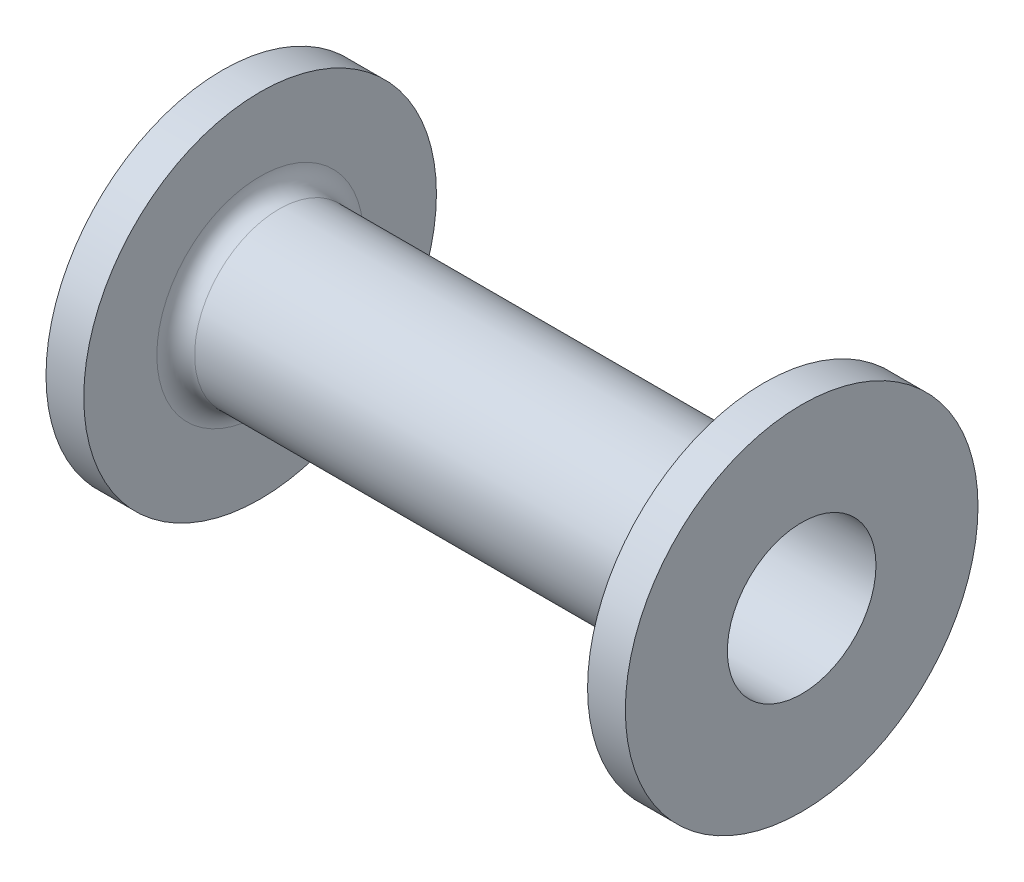
ISO-10303-21;
HEADER;
FILE_DESCRIPTION(('STEP AP214'),'2;1');
FILE_NAME('part.step','',(''),(''),'','','');
FILE_SCHEMA(('AUTOMOTIVE_DESIGN { 1 0 10303 214 1 1 1 1 }'));
ENDSEC;
DATA;
#1=APPLICATION_CONTEXT('core data for automotive mechanical design processes');
#2=APPLICATION_PROTOCOL_DEFINITION('international standard','automotive_design',2000,#1);
#3=PRODUCT_CONTEXT('',#1,'mechanical');
#4=PRODUCT('Part','Part','',(#3));
#5=PRODUCT_RELATED_PRODUCT_CATEGORY('part','',(#4));
#6=PRODUCT_DEFINITION_FORMATION('','',#4);
#7=PRODUCT_DEFINITION_CONTEXT('part definition',#1,'design');
#8=PRODUCT_DEFINITION('design','',#6,#7);
#9=PRODUCT_DEFINITION_SHAPE('','',#8);
#10=(LENGTH_UNIT() NAMED_UNIT(*) SI_UNIT(.MILLI.,.METRE.));
#11=(NAMED_UNIT(*) PLANE_ANGLE_UNIT() SI_UNIT($,.RADIAN.));
#12=(NAMED_UNIT(*) SI_UNIT($,.STERADIAN.) SOLID_ANGLE_UNIT());
#13=UNCERTAINTY_MEASURE_WITH_UNIT(LENGTH_MEASURE(1.E-05),#10,'distance_accuracy_value','');
#14=(GEOMETRIC_REPRESENTATION_CONTEXT(3) GLOBAL_UNCERTAINTY_ASSIGNED_CONTEXT((#13)) GLOBAL_UNIT_ASSIGNED_CONTEXT((#10,
#11,#12)) REPRESENTATION_CONTEXT('',''));
#15=CARTESIAN_POINT('',(0.,0.,0.));
#16=DIRECTION('',(0.,0.,1.));
#17=DIRECTION('',(1.,0.,0.));
#18=AXIS2_PLACEMENT_3D('',#15,#16,#17);
#19=CARTESIAN_POINT('',(0.,0.,0.));
#20=DIRECTION('',(1.,0.,0.));
#21=DIRECTION('',(0.,0.,-1.));
#22=AXIS2_PLACEMENT_3D('',#19,#20,#21);
#23=CYLINDRICAL_SURFACE('',#22,14.);
#24=CARTESIAN_POINT('',(0.,0.,0.));
#25=DIRECTION('',(1.,0.,0.));
#26=DIRECTION('',(0.,0.,-1.));
#27=AXIS2_PLACEMENT_3D('',#24,#25,#26);
#28=CIRCLE('',#27,14.);
#29=CARTESIAN_POINT('',(0.,0.,-14.));
#30=VERTEX_POINT('',#29);
#31=EDGE_CURVE('E68',#30,#30,#28,.T.);
#32=ORIENTED_EDGE('',*,*,#31,.T.);
#33=EDGE_LOOP('',(#32));
#34=FACE_BOUND('',#33,.T.);
#35=CARTESIAN_POINT('',(3.,0.,0.));
#36=DIRECTION('',(1.,0.,0.));
#37=DIRECTION('',(0.,0.,-1.));
#38=AXIS2_PLACEMENT_3D('',#35,#36,#37);
#39=CIRCLE('',#38,14.);
#40=CARTESIAN_POINT('',(3.,0.,-14.));
#41=VERTEX_POINT('',#40);
#42=EDGE_CURVE('E10',#41,#41,#39,.T.);
#43=ORIENTED_EDGE('',*,*,#42,.F.);
#44=EDGE_LOOP('',(#43));
#45=FACE_BOUND('',#44,.T.);
#46=ADVANCED_FACE('F34',(#34,#45),#23,.T.);
#47=CARTESIAN_POINT('',(3.,14.,0.));
#48=DIRECTION('',(1.,0.,0.));
#49=DIRECTION('',(0.,0.,-1.));
#50=AXIS2_PLACEMENT_3D('',#47,#48,#49);
#51=PLANE('',#50);
#52=ORIENTED_EDGE('',*,*,#42,.T.);
#53=EDGE_LOOP('',(#52));
#54=FACE_BOUND('',#53,.T.);
#55=CARTESIAN_POINT('',(3.,0.,0.));
#56=DIRECTION('',(1.,0.,0.));
#57=DIRECTION('',(0.,0.,-1.));
#58=AXIS2_PLACEMENT_3D('',#55,#56,#57);
#59=CIRCLE('',#58,8.2);
#60=CARTESIAN_POINT('',(3.,0.,-8.2));
#61=VERTEX_POINT('',#60);
#62=EDGE_CURVE('E40',#61,#61,#59,.T.);
#63=ORIENTED_EDGE('',*,*,#62,.F.);
#64=EDGE_LOOP('',(#63));
#65=FACE_BOUND('',#64,.T.);
#66=ADVANCED_FACE('F86',(#54,#65),#51,.T.);
#67=CARTESIAN_POINT('',(4.5,0.,0.));
#68=DIRECTION('',(1.,0.,0.));
#69=DIRECTION('',(0.,0.,-1.));
#70=AXIS2_PLACEMENT_3D('',#67,#68,#69);
#71=TOROIDAL_SURFACE('',#70,8.2,1.5);
#72=ORIENTED_EDGE('',*,*,#62,.T.);
#73=EDGE_LOOP('',(#72));
#74=FACE_BOUND('',#73,.T.);
#75=CARTESIAN_POINT('',(4.5,0.,0.));
#76=DIRECTION('',(1.,0.,0.));
#77=DIRECTION('',(0.,0.,-1.));
#78=AXIS2_PLACEMENT_3D('',#75,#76,#77);
#79=CIRCLE('',#78,6.7);
#80=CARTESIAN_POINT('',(4.5,0.,-6.7));
#81=VERTEX_POINT('',#80);
#82=EDGE_CURVE('E44',#81,#81,#79,.T.);
#83=ORIENTED_EDGE('',*,*,#82,.F.);
#84=EDGE_LOOP('',(#83));
#85=FACE_BOUND('',#84,.T.);
#86=ADVANCED_FACE('F90',(#74,#85),#71,.F.);
#87=CARTESIAN_POINT('',(0.,0.,0.));
#88=DIRECTION('',(1.,0.,0.));
#89=DIRECTION('',(0.,0.,-1.));
#90=AXIS2_PLACEMENT_3D('',#87,#88,#89);
#91=CYLINDRICAL_SURFACE('',#90,6.7);
#92=ORIENTED_EDGE('',*,*,#82,.T.);
#93=EDGE_LOOP('',(#92));
#94=FACE_BOUND('',#93,.T.);
#95=CARTESIAN_POINT('',(41.5,0.,0.));
#96=DIRECTION('',(1.,0.,0.));
#97=DIRECTION('',(0.,0.,-1.));
#98=AXIS2_PLACEMENT_3D('',#95,#96,#97);
#99=CIRCLE('',#98,6.7);
#100=CARTESIAN_POINT('',(41.5,0.,-6.7));
#101=VERTEX_POINT('',#100);
#102=EDGE_CURVE('E48',#101,#101,#99,.T.);
#103=ORIENTED_EDGE('',*,*,#102,.F.);
#104=EDGE_LOOP('',(#103));
#105=FACE_BOUND('',#104,.T.);
#106=ADVANCED_FACE('F94',(#94,#105),#91,.T.);
#107=CARTESIAN_POINT('',(41.5,0.,0.));
#108=DIRECTION('',(1.,0.,0.));
#109=DIRECTION('',(0.,0.,-1.));
#110=AXIS2_PLACEMENT_3D('',#107,#108,#109);
#111=TOROIDAL_SURFACE('',#110,8.2,1.5);
#112=ORIENTED_EDGE('',*,*,#102,.T.);
#113=EDGE_LOOP('',(#112));
#114=FACE_BOUND('',#113,.T.);
#115=CARTESIAN_POINT('',(43.,0.,0.));
#116=DIRECTION('',(1.,0.,0.));
#117=DIRECTION('',(0.,0.,-1.));
#118=AXIS2_PLACEMENT_3D('',#115,#116,#117);
#119=CIRCLE('',#118,8.2);
#120=CARTESIAN_POINT('',(43.,0.,-8.2));
#121=VERTEX_POINT('',#120);
#122=EDGE_CURVE('E53',#121,#121,#119,.T.);
#123=ORIENTED_EDGE('',*,*,#122,.F.);
#124=EDGE_LOOP('',(#123));
#125=FACE_BOUND('',#124,.T.);
#126=ADVANCED_FACE('F100',(#114,#125),#111,.F.);
#127=CARTESIAN_POINT('',(43.,8.2,0.));
#128=DIRECTION('',(-1.,0.,0.));
#129=DIRECTION('',(0.,0.,1.));
#130=AXIS2_PLACEMENT_3D('',#127,#128,#129);
#131=PLANE('',#130);
#132=ORIENTED_EDGE('',*,*,#122,.T.);
#133=EDGE_LOOP('',(#132));
#134=FACE_BOUND('',#133,.T.);
#135=CARTESIAN_POINT('',(43.,0.,0.));
#136=DIRECTION('',(1.,0.,0.));
#137=DIRECTION('',(0.,0.,-1.));
#138=AXIS2_PLACEMENT_3D('',#135,#136,#137);
#139=CIRCLE('',#138,14.);
#140=CARTESIAN_POINT('',(43.,0.,-14.));
#141=VERTEX_POINT('',#140);
#142=EDGE_CURVE('E56',#141,#141,#139,.T.);
#143=ORIENTED_EDGE('',*,*,#142,.F.);
#144=EDGE_LOOP('',(#143));
#145=FACE_BOUND('',#144,.T.);
#146=ADVANCED_FACE('F104',(#134,#145),#131,.T.);
#147=CARTESIAN_POINT('',(0.,0.,0.));
#148=DIRECTION('',(1.,0.,0.));
#149=DIRECTION('',(0.,0.,-1.));
#150=AXIS2_PLACEMENT_3D('',#147,#148,#149);
#151=CYLINDRICAL_SURFACE('',#150,14.);
#152=ORIENTED_EDGE('',*,*,#142,.T.);
#153=EDGE_LOOP('',(#152));
#154=FACE_BOUND('',#153,.T.);
#155=CARTESIAN_POINT('',(46.,0.,0.));
#156=DIRECTION('',(1.,0.,0.));
#157=DIRECTION('',(0.,0.,-1.));
#158=AXIS2_PLACEMENT_3D('',#155,#156,#157);
#159=CIRCLE('',#158,14.);
#160=CARTESIAN_POINT('',(46.,0.,-14.));
#161=VERTEX_POINT('',#160);
#162=EDGE_CURVE('E59',#161,#161,#159,.T.);
#163=ORIENTED_EDGE('',*,*,#162,.F.);
#164=EDGE_LOOP('',(#163));
#165=FACE_BOUND('',#164,.T.);
#166=ADVANCED_FACE('F108',(#154,#165),#151,.T.);
#167=CARTESIAN_POINT('',(46.,14.,0.));
#168=DIRECTION('',(1.,0.,0.));
#169=DIRECTION('',(0.,0.,-1.));
#170=AXIS2_PLACEMENT_3D('',#167,#168,#169);
#171=PLANE('',#170);
#172=ORIENTED_EDGE('',*,*,#162,.T.);
#173=EDGE_LOOP('',(#172));
#174=FACE_BOUND('',#173,.T.);
#175=CARTESIAN_POINT('',(46.,0.,0.));
#176=DIRECTION('',(1.,0.,0.));
#177=DIRECTION('',(0.,0.,-1.));
#178=AXIS2_PLACEMENT_3D('',#175,#176,#177);
#179=CIRCLE('',#178,5.9);
#180=CARTESIAN_POINT('',(46.,0.,-5.9));
#181=VERTEX_POINT('',#180);
#182=EDGE_CURVE('E62',#181,#181,#179,.T.);
#183=ORIENTED_EDGE('',*,*,#182,.F.);
#184=EDGE_LOOP('',(#183));
#185=FACE_BOUND('',#184,.T.);
#186=ADVANCED_FACE('F82',(#174,#185),#171,.T.);
#187=CARTESIAN_POINT('',(0.,0.,0.));
#188=DIRECTION('',(1.,0.,0.));
#189=DIRECTION('',(0.,0.,-1.));
#190=AXIS2_PLACEMENT_3D('',#187,#188,#189);
#191=CYLINDRICAL_SURFACE('',#190,5.9);
#192=ORIENTED_EDGE('',*,*,#182,.T.);
#193=EDGE_LOOP('',(#192));
#194=FACE_BOUND('',#193,.T.);
#195=CARTESIAN_POINT('',(0.,0.,0.));
#196=DIRECTION('',(1.,0.,0.));
#197=DIRECTION('',(0.,0.,-1.));
#198=AXIS2_PLACEMENT_3D('',#195,#196,#197);
#199=CIRCLE('',#198,5.9);
#200=CARTESIAN_POINT('',(0.,0.,-5.9));
#201=VERTEX_POINT('',#200);
#202=EDGE_CURVE('E65',#201,#201,#199,.T.);
#203=ORIENTED_EDGE('',*,*,#202,.F.);
#204=EDGE_LOOP('',(#203));
#205=FACE_BOUND('',#204,.T.);
#206=ADVANCED_FACE('F76',(#194,#205),#191,.F.);
#207=CARTESIAN_POINT('',(0.,5.9,0.));
#208=DIRECTION('',(-1.,0.,0.));
#209=DIRECTION('',(0.,0.,1.));
#210=AXIS2_PLACEMENT_3D('',#207,#208,#209);
#211=PLANE('',#210);
#212=ORIENTED_EDGE('',*,*,#202,.T.);
#213=EDGE_LOOP('',(#212));
#214=FACE_BOUND('',#213,.T.);
#215=ORIENTED_EDGE('',*,*,#31,.F.);
#216=EDGE_LOOP('',(#215));
#217=FACE_BOUND('',#216,.T.);
#218=ADVANCED_FACE('F74',(#214,#217),#211,.T.);
#219=CLOSED_SHELL('',(#46,#66,#86,#106,#126,#146,#166,#186,#206,#218));
#220=MANIFOLD_SOLID_BREP('B2',#219);
#221=ADVANCED_BREP_SHAPE_REPRESENTATION('',(#18,#220),#14);
#222=SHAPE_DEFINITION_REPRESENTATION(#9,#221);
ENDSEC;
END-ISO-10303-21;
